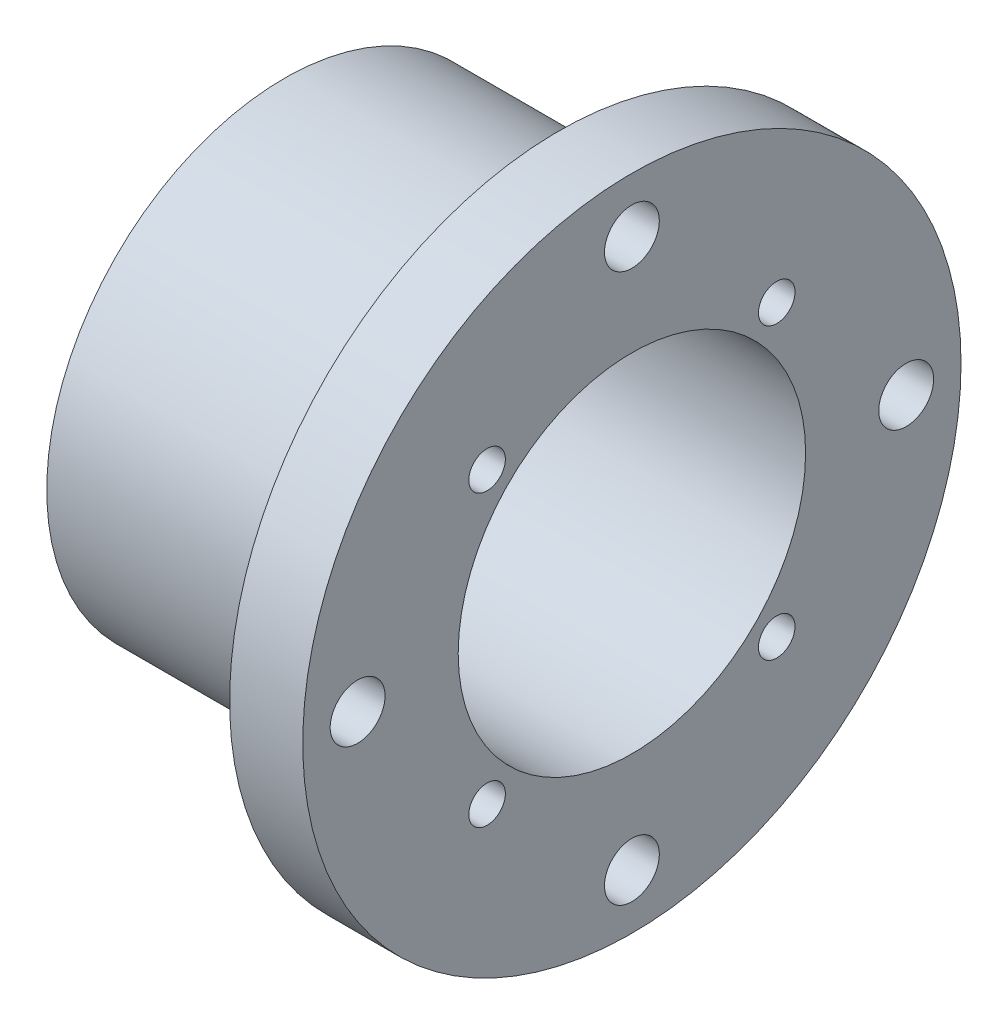
ISO-10303-21;
HEADER;
FILE_DESCRIPTION(('STEP AP214'),'2;1');
FILE_NAME('part.step','',(''),(''),'','','');
FILE_SCHEMA(('AUTOMOTIVE_DESIGN { 1 0 10303 214 1 1 1 1 }'));
ENDSEC;
DATA;
#1=APPLICATION_CONTEXT('core data for automotive mechanical design processes');
#2=APPLICATION_PROTOCOL_DEFINITION('international standard','automotive_design',2000,#1);
#3=PRODUCT_CONTEXT('',#1,'mechanical');
#4=PRODUCT('Part','Part','',(#3));
#5=PRODUCT_RELATED_PRODUCT_CATEGORY('part','',(#4));
#6=PRODUCT_DEFINITION_FORMATION('','',#4);
#7=PRODUCT_DEFINITION_CONTEXT('part definition',#1,'design');
#8=PRODUCT_DEFINITION('design','',#6,#7);
#9=PRODUCT_DEFINITION_SHAPE('','',#8);
#10=(LENGTH_UNIT() NAMED_UNIT(*) SI_UNIT(.MILLI.,.METRE.));
#11=(NAMED_UNIT(*) PLANE_ANGLE_UNIT() SI_UNIT($,.RADIAN.));
#12=(NAMED_UNIT(*) SI_UNIT($,.STERADIAN.) SOLID_ANGLE_UNIT());
#13=UNCERTAINTY_MEASURE_WITH_UNIT(LENGTH_MEASURE(1.E-05),#10,'distance_accuracy_value','');
#14=(GEOMETRIC_REPRESENTATION_CONTEXT(3) GLOBAL_UNCERTAINTY_ASSIGNED_CONTEXT((#13)) GLOBAL_UNIT_ASSIGNED_CONTEXT((#10,
#11,#12)) REPRESENTATION_CONTEXT('',''));
#15=CARTESIAN_POINT('',(0.,0.,0.));
#16=DIRECTION('',(0.,0.,1.));
#17=DIRECTION('',(1.,0.,0.));
#18=AXIS2_PLACEMENT_3D('',#15,#16,#17);
#19=CARTESIAN_POINT('',(15.,0.,0.));
#20=DIRECTION('',(-1.,0.,0.));
#21=DIRECTION('',(0.,0.,1.));
#22=AXIS2_PLACEMENT_3D('',#19,#20,#21);
#23=CYLINDRICAL_SURFACE('',#22,9.5);
#24=CARTESIAN_POINT('',(19.,0.,0.));
#25=DIRECTION('',(1.,0.,0.));
#26=DIRECTION('',(0.,0.,-1.));
#27=AXIS2_PLACEMENT_3D('',#24,#25,#26);
#28=CIRCLE('',#27,9.5);
#29=CARTESIAN_POINT('',(19.,0.,-9.5));
#30=VERTEX_POINT('',#29);
#31=EDGE_CURVE('E81',#30,#30,#28,.T.);
#32=ORIENTED_EDGE('',*,*,#31,.T.);
#33=EDGE_LOOP('',(#32));
#34=FACE_BOUND('',#33,.T.);
#35=CARTESIAN_POINT('',(2.,0.,0.));
#36=DIRECTION('',(-1.,0.,0.));
#37=DIRECTION('',(0.,0.,1.));
#38=AXIS2_PLACEMENT_3D('',#35,#36,#37);
#39=CIRCLE('',#38,9.5);
#40=CARTESIAN_POINT('',(2.,0.,9.5));
#41=VERTEX_POINT('',#40);
#42=EDGE_CURVE('E75',#41,#41,#39,.T.);
#43=ORIENTED_EDGE('',*,*,#42,.T.);
#44=EDGE_LOOP('',(#43));
#45=FACE_BOUND('',#44,.T.);
#46=ADVANCED_FACE('F36',(#34,#45),#23,.F.);
#47=CARTESIAN_POINT('',(0.,0.,0.));
#48=DIRECTION('',(1.,0.,0.));
#49=DIRECTION('',(0.,0.,-1.));
#50=AXIS2_PLACEMENT_3D('',#47,#48,#49);
#51=PLANE('',#50);
#52=CARTESIAN_POINT('',(0.,0.,0.));
#53=DIRECTION('',(1.,0.,0.));
#54=DIRECTION('',(0.,0.,-1.));
#55=AXIS2_PLACEMENT_3D('',#52,#53,#54);
#56=CIRCLE('',#55,13.);
#57=CARTESIAN_POINT('',(0.,0.,-13.));
#58=VERTEX_POINT('',#57);
#59=EDGE_CURVE('E44',#58,#58,#56,.T.);
#60=ORIENTED_EDGE('',*,*,#59,.F.);
#61=EDGE_LOOP('',(#60));
#62=FACE_BOUND('',#61,.T.);
#63=CARTESIAN_POINT('',(0.,0.,0.));
#64=DIRECTION('',(-1.,0.,0.));
#65=DIRECTION('',(0.,0.,1.));
#66=AXIS2_PLACEMENT_3D('',#63,#64,#65);
#67=CIRCLE('',#66,8.5);
#68=CARTESIAN_POINT('',(0.,0.,8.5));
#69=VERTEX_POINT('',#68);
#70=EDGE_CURVE('E66',#69,#69,#67,.T.);
#71=ORIENTED_EDGE('',*,*,#70,.F.);
#72=EDGE_LOOP('',(#71));
#73=FACE_BOUND('',#72,.T.);
#74=ADVANCED_FACE('F107',(#62,#73),#51,.F.);
#75=CARTESIAN_POINT('',(15.,0.,0.));
#76=DIRECTION('',(-1.,0.,0.));
#77=DIRECTION('',(0.,0.,1.));
#78=AXIS2_PLACEMENT_3D('',#75,#76,#77);
#79=CYLINDRICAL_SURFACE('',#78,13.);
#80=CARTESIAN_POINT('',(15.,0.,0.));
#81=DIRECTION('',(1.,0.,0.));
#82=DIRECTION('',(0.,0.,-1.));
#83=AXIS2_PLACEMENT_3D('',#80,#81,#82);
#84=CIRCLE('',#83,13.);
#85=CARTESIAN_POINT('',(15.,0.,-13.));
#86=VERTEX_POINT('',#85);
#87=EDGE_CURVE('E10',#86,#86,#84,.T.);
#88=ORIENTED_EDGE('',*,*,#87,.F.);
#89=EDGE_LOOP('',(#88));
#90=FACE_BOUND('',#89,.T.);
#91=ORIENTED_EDGE('',*,*,#59,.T.);
#92=EDGE_LOOP('',(#91));
#93=FACE_BOUND('',#92,.T.);
#94=ADVANCED_FACE('F38',(#90,#93),#79,.T.);
#95=CARTESIAN_POINT('',(19.,0.,0.));
#96=DIRECTION('',(1.,0.,0.));
#97=DIRECTION('',(0.,0.,-1.));
#98=AXIS2_PLACEMENT_3D('',#95,#96,#97);
#99=PLANE('',#98);
#100=CARTESIAN_POINT('',(19.,7.91959594928935,7.91959594928932));
#101=DIRECTION('',(1.,0.,0.));
#102=DIRECTION('',(0.,0.,-1.));
#103=AXIS2_PLACEMENT_3D('',#100,#101,#102);
#104=CIRCLE('',#103,1.);
#105=CARTESIAN_POINT('',(19.,7.91959594928935,6.91959594928932));
#106=VERTEX_POINT('',#105);
#107=EDGE_CURVE('E196',#106,#106,#104,.T.);
#108=ORIENTED_EDGE('',*,*,#107,.F.);
#109=EDGE_LOOP('',(#108));
#110=FACE_BOUND('',#109,.T.);
#111=CARTESIAN_POINT('',(19.,-7.91959594928932,7.91959594928935));
#112=DIRECTION('',(1.,0.,0.));
#113=DIRECTION('',(0.,0.,-1.));
#114=AXIS2_PLACEMENT_3D('',#111,#112,#113);
#115=CIRCLE('',#114,1.);
#116=CARTESIAN_POINT('',(19.,-7.91959594928932,6.91959594928934));
#117=VERTEX_POINT('',#116);
#118=EDGE_CURVE('E188',#117,#117,#115,.T.);
#119=ORIENTED_EDGE('',*,*,#118,.F.);
#120=EDGE_LOOP('',(#119));
#121=FACE_BOUND('',#120,.T.);
#122=CARTESIAN_POINT('',(19.,-7.91959594928935,-7.91959594928932));
#123=DIRECTION('',(1.,0.,0.));
#124=DIRECTION('',(0.,0.,-1.));
#125=AXIS2_PLACEMENT_3D('',#122,#123,#124);
#126=CIRCLE('',#125,1.);
#127=CARTESIAN_POINT('',(19.,-7.91959594928935,-8.91959594928932));
#128=VERTEX_POINT('',#127);
#129=EDGE_CURVE('E181',#128,#128,#126,.T.);
#130=ORIENTED_EDGE('',*,*,#129,.F.);
#131=EDGE_LOOP('',(#130));
#132=FACE_BOUND('',#131,.T.);
#133=CARTESIAN_POINT('',(19.,7.91959594928932,-7.91959594928935));
#134=DIRECTION('',(1.,0.,0.));
#135=DIRECTION('',(0.,0.,-1.));
#136=AXIS2_PLACEMENT_3D('',#133,#134,#135);
#137=CIRCLE('',#136,1.);
#138=CARTESIAN_POINT('',(19.,7.91959594928932,-8.91959594928935));
#139=VERTEX_POINT('',#138);
#140=EDGE_CURVE('E183',#139,#139,#137,.T.);
#141=ORIENTED_EDGE('',*,*,#140,.F.);
#142=EDGE_LOOP('',(#141));
#143=FACE_BOUND('',#142,.T.);
#144=CARTESIAN_POINT('',(19.,15.,0.));
#145=DIRECTION('',(1.,0.,0.));
#146=DIRECTION('',(0.,0.,-1.));
#147=AXIS2_PLACEMENT_3D('',#144,#145,#146);
#148=CIRCLE('',#147,1.5);
#149=CARTESIAN_POINT('',(19.,15.,-1.5));
#150=VERTEX_POINT('',#149);
#151=EDGE_CURVE('E59',#150,#150,#148,.T.);
#152=ORIENTED_EDGE('',*,*,#151,.F.);
#153=EDGE_LOOP('',(#152));
#154=FACE_BOUND('',#153,.T.);
#155=CARTESIAN_POINT('',(19.,0.,-15.));
#156=DIRECTION('',(1.,0.,0.));
#157=DIRECTION('',(0.,0.,-1.));
#158=AXIS2_PLACEMENT_3D('',#155,#156,#157);
#159=CIRCLE('',#158,1.5);
#160=CARTESIAN_POINT('',(19.,0.,-16.5));
#161=VERTEX_POINT('',#160);
#162=EDGE_CURVE('E207',#161,#161,#159,.T.);
#163=ORIENTED_EDGE('',*,*,#162,.F.);
#164=EDGE_LOOP('',(#163));
#165=FACE_BOUND('',#164,.T.);
#166=CARTESIAN_POINT('',(19.,-15.,1.04744440165294E-13));
#167=DIRECTION('',(1.,0.,0.));
#168=DIRECTION('',(0.,0.,-1.));
#169=AXIS2_PLACEMENT_3D('',#166,#167,#168);
#170=CIRCLE('',#169,1.5);
#171=CARTESIAN_POINT('',(19.,-15.,-1.49999999999989));
#172=VERTEX_POINT('',#171);
#173=EDGE_CURVE('E210',#172,#172,#170,.T.);
#174=ORIENTED_EDGE('',*,*,#173,.F.);
#175=EDGE_LOOP('',(#174));
#176=FACE_BOUND('',#175,.T.);
#177=CARTESIAN_POINT('',(19.,1.57116660247941E-13,15.));
#178=DIRECTION('',(1.,0.,0.));
#179=DIRECTION('',(0.,0.,-1.));
#180=AXIS2_PLACEMENT_3D('',#177,#178,#179);
#181=CIRCLE('',#180,1.5);
#182=CARTESIAN_POINT('',(19.,1.57116660247941E-13,13.5));
#183=VERTEX_POINT('',#182);
#184=EDGE_CURVE('E203',#183,#183,#181,.T.);
#185=ORIENTED_EDGE('',*,*,#184,.F.);
#186=EDGE_LOOP('',(#185));
#187=FACE_BOUND('',#186,.T.);
#188=CARTESIAN_POINT('',(19.,0.,0.));
#189=DIRECTION('',(1.,0.,0.));
#190=DIRECTION('',(0.,0.,-1.));
#191=AXIS2_PLACEMENT_3D('',#188,#189,#190);
#192=CIRCLE('',#191,18.);
#193=CARTESIAN_POINT('',(19.,0.,-18.));
#194=VERTEX_POINT('',#193);
#195=EDGE_CURVE('E49',#194,#194,#192,.T.);
#196=ORIENTED_EDGE('',*,*,#195,.T.);
#197=EDGE_LOOP('',(#196));
#198=FACE_BOUND('',#197,.T.);
#199=ORIENTED_EDGE('',*,*,#31,.F.);
#200=EDGE_LOOP('',(#199));
#201=FACE_BOUND('',#200,.T.);
#202=ADVANCED_FACE('F93',(#110,#121,#132,#143,#154,#165,#176,#187,#198,#201),#99,.T.);
#203=CARTESIAN_POINT('',(15.,0.,0.));
#204=DIRECTION('',(1.,0.,0.));
#205=DIRECTION('',(0.,0.,-1.));
#206=AXIS2_PLACEMENT_3D('',#203,#204,#205);
#207=PLANE('',#206);
#208=CARTESIAN_POINT('',(15.,15.,0.));
#209=DIRECTION('',(1.,0.,0.));
#210=DIRECTION('',(0.,0.,-1.));
#211=AXIS2_PLACEMENT_3D('',#208,#209,#210);
#212=CIRCLE('',#211,1.5);
#213=CARTESIAN_POINT('',(15.,15.,-1.5));
#214=VERTEX_POINT('',#213);
#215=EDGE_CURVE('E40',#214,#214,#212,.T.);
#216=ORIENTED_EDGE('',*,*,#215,.T.);
#217=EDGE_LOOP('',(#216));
#218=FACE_BOUND('',#217,.T.);
#219=CARTESIAN_POINT('',(15.,0.,-15.));
#220=DIRECTION('',(1.,0.,0.));
#221=DIRECTION('',(0.,0.,-1.));
#222=AXIS2_PLACEMENT_3D('',#219,#220,#221);
#223=CIRCLE('',#222,1.5);
#224=CARTESIAN_POINT('',(15.,0.,-16.5));
#225=VERTEX_POINT('',#224);
#226=EDGE_CURVE('E61',#225,#225,#223,.T.);
#227=ORIENTED_EDGE('',*,*,#226,.T.);
#228=EDGE_LOOP('',(#227));
#229=FACE_BOUND('',#228,.T.);
#230=CARTESIAN_POINT('',(15.,-15.,1.04744440165294E-13));
#231=DIRECTION('',(1.,0.,0.));
#232=DIRECTION('',(0.,0.,-1.));
#233=AXIS2_PLACEMENT_3D('',#230,#231,#232);
#234=CIRCLE('',#233,1.5);
#235=CARTESIAN_POINT('',(15.,-15.,-1.49999999999989));
#236=VERTEX_POINT('',#235);
#237=EDGE_CURVE('E58',#236,#236,#234,.T.);
#238=ORIENTED_EDGE('',*,*,#237,.T.);
#239=EDGE_LOOP('',(#238));
#240=FACE_BOUND('',#239,.T.);
#241=CARTESIAN_POINT('',(15.,1.57116660247941E-13,15.));
#242=DIRECTION('',(1.,0.,0.));
#243=DIRECTION('',(0.,0.,-1.));
#244=AXIS2_PLACEMENT_3D('',#241,#242,#243);
#245=CIRCLE('',#244,1.5);
#246=CARTESIAN_POINT('',(15.,1.57116660247941E-13,13.5));
#247=VERTEX_POINT('',#246);
#248=EDGE_CURVE('E55',#247,#247,#245,.T.);
#249=ORIENTED_EDGE('',*,*,#248,.T.);
#250=EDGE_LOOP('',(#249));
#251=FACE_BOUND('',#250,.T.);
#252=ORIENTED_EDGE('',*,*,#87,.T.);
#253=EDGE_LOOP('',(#252));
#254=FACE_BOUND('',#253,.T.);
#255=CARTESIAN_POINT('',(15.,0.,0.));
#256=DIRECTION('',(1.,0.,0.));
#257=DIRECTION('',(0.,0.,-1.));
#258=AXIS2_PLACEMENT_3D('',#255,#256,#257);
#259=CIRCLE('',#258,18.);
#260=CARTESIAN_POINT('',(15.,0.,-18.));
#261=VERTEX_POINT('',#260);
#262=EDGE_CURVE('E52',#261,#261,#259,.T.);
#263=ORIENTED_EDGE('',*,*,#262,.F.);
#264=EDGE_LOOP('',(#263));
#265=FACE_BOUND('',#264,.T.);
#266=ADVANCED_FACE('F91',(#218,#229,#240,#251,#254,#265),#207,.F.);
#267=CARTESIAN_POINT('',(19.,0.,0.));
#268=DIRECTION('',(-1.,0.,0.));
#269=DIRECTION('',(0.,0.,1.));
#270=AXIS2_PLACEMENT_3D('',#267,#268,#269);
#271=CYLINDRICAL_SURFACE('',#270,18.);
#272=ORIENTED_EDGE('',*,*,#195,.F.);
#273=EDGE_LOOP('',(#272));
#274=FACE_BOUND('',#273,.T.);
#275=ORIENTED_EDGE('',*,*,#262,.T.);
#276=EDGE_LOOP('',(#275));
#277=FACE_BOUND('',#276,.T.);
#278=ADVANCED_FACE('F89',(#274,#277),#271,.T.);
#279=CARTESIAN_POINT('',(2.,0.,0.));
#280=DIRECTION('',(-1.,0.,0.));
#281=DIRECTION('',(0.,0.,1.));
#282=AXIS2_PLACEMENT_3D('',#279,#280,#281);
#283=PLANE('',#282);
#284=CARTESIAN_POINT('',(2.,0.,0.));
#285=DIRECTION('',(-1.,0.,0.));
#286=DIRECTION('',(0.,0.,1.));
#287=AXIS2_PLACEMENT_3D('',#284,#285,#286);
#288=CIRCLE('',#287,8.5);
#289=CARTESIAN_POINT('',(2.,0.,8.5));
#290=VERTEX_POINT('',#289);
#291=EDGE_CURVE('E70',#290,#290,#288,.T.);
#292=ORIENTED_EDGE('',*,*,#291,.T.);
#293=EDGE_LOOP('',(#292));
#294=FACE_BOUND('',#293,.T.);
#295=ORIENTED_EDGE('',*,*,#42,.F.);
#296=EDGE_LOOP('',(#295));
#297=FACE_BOUND('',#296,.T.);
#298=ADVANCED_FACE('F100',(#294,#297),#283,.F.);
#299=CARTESIAN_POINT('',(2.,0.,0.));
#300=DIRECTION('',(-1.,0.,0.));
#301=DIRECTION('',(0.,0.,1.));
#302=AXIS2_PLACEMENT_3D('',#299,#300,#301);
#303=CYLINDRICAL_SURFACE('',#302,8.5);
#304=ORIENTED_EDGE('',*,*,#291,.F.);
#305=EDGE_LOOP('',(#304));
#306=FACE_BOUND('',#305,.T.);
#307=ORIENTED_EDGE('',*,*,#70,.T.);
#308=EDGE_LOOP('',(#307));
#309=FACE_BOUND('',#308,.T.);
#310=ADVANCED_FACE('F119',(#306,#309),#303,.F.);
#311=CARTESIAN_POINT('',(0.,1.57116660247941E-13,15.));
#312=DIRECTION('',(1.,0.,0.));
#313=DIRECTION('',(0.,0.,-1.));
#314=AXIS2_PLACEMENT_3D('',#311,#312,#313);
#315=CYLINDRICAL_SURFACE('',#314,1.5);
#316=ORIENTED_EDGE('',*,*,#184,.T.);
#317=EDGE_LOOP('',(#316));
#318=FACE_BOUND('',#317,.T.);
#319=ORIENTED_EDGE('',*,*,#248,.F.);
#320=EDGE_LOOP('',(#319));
#321=FACE_BOUND('',#320,.T.);
#322=ADVANCED_FACE('F124',(#318,#321),#315,.F.);
#323=CARTESIAN_POINT('',(0.,-15.,1.04744440165294E-13));
#324=DIRECTION('',(1.,0.,0.));
#325=DIRECTION('',(0.,0.,-1.));
#326=AXIS2_PLACEMENT_3D('',#323,#324,#325);
#327=CYLINDRICAL_SURFACE('',#326,1.5);
#328=ORIENTED_EDGE('',*,*,#173,.T.);
#329=EDGE_LOOP('',(#328));
#330=FACE_BOUND('',#329,.T.);
#331=ORIENTED_EDGE('',*,*,#237,.F.);
#332=EDGE_LOOP('',(#331));
#333=FACE_BOUND('',#332,.T.);
#334=ADVANCED_FACE('F129',(#330,#333),#327,.F.);
#335=CARTESIAN_POINT('',(0.,0.,-15.));
#336=DIRECTION('',(1.,0.,0.));
#337=DIRECTION('',(0.,0.,-1.));
#338=AXIS2_PLACEMENT_3D('',#335,#336,#337);
#339=CYLINDRICAL_SURFACE('',#338,1.5);
#340=ORIENTED_EDGE('',*,*,#162,.T.);
#341=EDGE_LOOP('',(#340));
#342=FACE_BOUND('',#341,.T.);
#343=ORIENTED_EDGE('',*,*,#226,.F.);
#344=EDGE_LOOP('',(#343));
#345=FACE_BOUND('',#344,.T.);
#346=ADVANCED_FACE('F133',(#342,#345),#339,.F.);
#347=CARTESIAN_POINT('',(0.,15.,0.));
#348=DIRECTION('',(1.,0.,0.));
#349=DIRECTION('',(0.,0.,-1.));
#350=AXIS2_PLACEMENT_3D('',#347,#348,#349);
#351=CYLINDRICAL_SURFACE('',#350,1.5);
#352=ORIENTED_EDGE('',*,*,#151,.T.);
#353=EDGE_LOOP('',(#352));
#354=FACE_BOUND('',#353,.T.);
#355=ORIENTED_EDGE('',*,*,#215,.F.);
#356=EDGE_LOOP('',(#355));
#357=FACE_BOUND('',#356,.T.);
#358=ADVANCED_FACE('F137',(#354,#357),#351,.F.);
#359=CARTESIAN_POINT('',(11.,7.91959594928932,-7.91959594928935));
#360=DIRECTION('',(1.,0.,0.));
#361=DIRECTION('',(0.,0.,-1.));
#362=AXIS2_PLACEMENT_3D('',#359,#360,#361);
#363=CYLINDRICAL_SURFACE('',#362,1.);
#364=CARTESIAN_POINT('',(11.,7.91959594928932,-7.91959594928935));
#365=DIRECTION('',(1.,0.,0.));
#366=DIRECTION('',(0.,0.,-1.));
#367=AXIS2_PLACEMENT_3D('',#364,#365,#366);
#368=CIRCLE('',#367,1.);
#369=CARTESIAN_POINT('',(11.,7.91959594928932,-8.91959594928935));
#370=VERTEX_POINT('',#369);
#371=EDGE_CURVE('E186',#370,#370,#368,.T.);
#372=ORIENTED_EDGE('',*,*,#371,.F.);
#373=EDGE_LOOP('',(#372));
#374=FACE_BOUND('',#373,.T.);
#375=ORIENTED_EDGE('',*,*,#140,.T.);
#376=EDGE_LOOP('',(#375));
#377=FACE_BOUND('',#376,.T.);
#378=ADVANCED_FACE('F141',(#374,#377),#363,.F.);
#379=CARTESIAN_POINT('',(11.,7.91959594928932,-7.91959594928935));
#380=DIRECTION('',(1.,0.,0.));
#381=DIRECTION('',(0.,0.,-1.));
#382=AXIS2_PLACEMENT_3D('',#379,#380,#381);
#383=PLANE('',#382);
#384=ORIENTED_EDGE('',*,*,#371,.T.);
#385=EDGE_LOOP('',(#384));
#386=FACE_BOUND('',#385,.T.);
#387=ADVANCED_FACE('F145',(#386),#383,.T.);
#388=CARTESIAN_POINT('',(11.,-7.91959594928935,-7.91959594928932));
#389=DIRECTION('',(1.,0.,0.));
#390=DIRECTION('',(0.,0.,-1.));
#391=AXIS2_PLACEMENT_3D('',#388,#389,#390);
#392=CYLINDRICAL_SURFACE('',#391,1.);
#393=CARTESIAN_POINT('',(11.,-7.91959594928935,-7.91959594928932));
#394=DIRECTION('',(1.,0.,0.));
#395=DIRECTION('',(0.,0.,-1.));
#396=AXIS2_PLACEMENT_3D('',#393,#394,#395);
#397=CIRCLE('',#396,1.);
#398=CARTESIAN_POINT('',(11.,-7.91959594928935,-8.91959594928932));
#399=VERTEX_POINT('',#398);
#400=EDGE_CURVE('E178',#399,#399,#397,.T.);
#401=ORIENTED_EDGE('',*,*,#400,.F.);
#402=EDGE_LOOP('',(#401));
#403=FACE_BOUND('',#402,.T.);
#404=ORIENTED_EDGE('',*,*,#129,.T.);
#405=EDGE_LOOP('',(#404));
#406=FACE_BOUND('',#405,.T.);
#407=ADVANCED_FACE('F149',(#403,#406),#392,.F.);
#408=CARTESIAN_POINT('',(11.,-7.91959594928935,-7.91959594928932));
#409=DIRECTION('',(1.,0.,0.));
#410=DIRECTION('',(0.,0.,-1.));
#411=AXIS2_PLACEMENT_3D('',#408,#409,#410);
#412=PLANE('',#411);
#413=ORIENTED_EDGE('',*,*,#400,.T.);
#414=EDGE_LOOP('',(#413));
#415=FACE_BOUND('',#414,.T.);
#416=ADVANCED_FACE('F166',(#415),#412,.T.);
#417=CARTESIAN_POINT('',(11.,-7.91959594928932,7.91959594928935));
#418=DIRECTION('',(1.,0.,0.));
#419=DIRECTION('',(0.,0.,-1.));
#420=AXIS2_PLACEMENT_3D('',#417,#418,#419);
#421=CYLINDRICAL_SURFACE('',#420,1.);
#422=CARTESIAN_POINT('',(11.,-7.91959594928932,7.91959594928935));
#423=DIRECTION('',(1.,0.,0.));
#424=DIRECTION('',(0.,0.,-1.));
#425=AXIS2_PLACEMENT_3D('',#422,#423,#424);
#426=CIRCLE('',#425,1.);
#427=CARTESIAN_POINT('',(11.,-7.91959594928932,6.91959594928934));
#428=VERTEX_POINT('',#427);
#429=EDGE_CURVE('E193',#428,#428,#426,.T.);
#430=ORIENTED_EDGE('',*,*,#429,.F.);
#431=EDGE_LOOP('',(#430));
#432=FACE_BOUND('',#431,.T.);
#433=ORIENTED_EDGE('',*,*,#118,.T.);
#434=EDGE_LOOP('',(#433));
#435=FACE_BOUND('',#434,.T.);
#436=ADVANCED_FACE('F162',(#432,#435),#421,.F.);
#437=CARTESIAN_POINT('',(11.,-7.91959594928932,7.91959594928935));
#438=DIRECTION('',(1.,0.,0.));
#439=DIRECTION('',(0.,0.,-1.));
#440=AXIS2_PLACEMENT_3D('',#437,#438,#439);
#441=PLANE('',#440);
#442=ORIENTED_EDGE('',*,*,#429,.T.);
#443=EDGE_LOOP('',(#442));
#444=FACE_BOUND('',#443,.T.);
#445=ADVANCED_FACE('F158',(#444),#441,.T.);
#446=CARTESIAN_POINT('',(11.,7.91959594928935,7.91959594928932));
#447=DIRECTION('',(1.,0.,0.));
#448=DIRECTION('',(0.,0.,-1.));
#449=AXIS2_PLACEMENT_3D('',#446,#447,#448);
#450=CYLINDRICAL_SURFACE('',#449,1.);
#451=CARTESIAN_POINT('',(11.,7.91959594928935,7.91959594928932));
#452=DIRECTION('',(1.,0.,0.));
#453=DIRECTION('',(0.,0.,-1.));
#454=AXIS2_PLACEMENT_3D('',#451,#452,#453);
#455=CIRCLE('',#454,1.);
#456=CARTESIAN_POINT('',(11.,7.91959594928935,6.91959594928932));
#457=VERTEX_POINT('',#456);
#458=EDGE_CURVE('E199',#457,#457,#455,.T.);
#459=ORIENTED_EDGE('',*,*,#458,.F.);
#460=EDGE_LOOP('',(#459));
#461=FACE_BOUND('',#460,.T.);
#462=ORIENTED_EDGE('',*,*,#107,.T.);
#463=EDGE_LOOP('',(#462));
#464=FACE_BOUND('',#463,.T.);
#465=ADVANCED_FACE('F154',(#461,#464),#450,.F.);
#466=CARTESIAN_POINT('',(11.,7.91959594928935,7.91959594928932));
#467=DIRECTION('',(1.,0.,0.));
#468=DIRECTION('',(0.,0.,-1.));
#469=AXIS2_PLACEMENT_3D('',#466,#467,#468);
#470=PLANE('',#469);
#471=ORIENTED_EDGE('',*,*,#458,.T.);
#472=EDGE_LOOP('',(#471));
#473=FACE_BOUND('',#472,.T.);
#474=ADVANCED_FACE('F151',(#473),#470,.T.);
#475=CLOSED_SHELL('',(#46,#74,#94,#202,#266,#278,#298,#310,#322,#334,#346,#358,#378,#387,#407,
#416,#436,#445,#465,#474));
#476=MANIFOLD_SOLID_BREP('B2',#475);
#477=ADVANCED_BREP_SHAPE_REPRESENTATION('',(#18,#476),#14);
#478=SHAPE_DEFINITION_REPRESENTATION(#9,#477);
ENDSEC;
END-ISO-10303-21;
